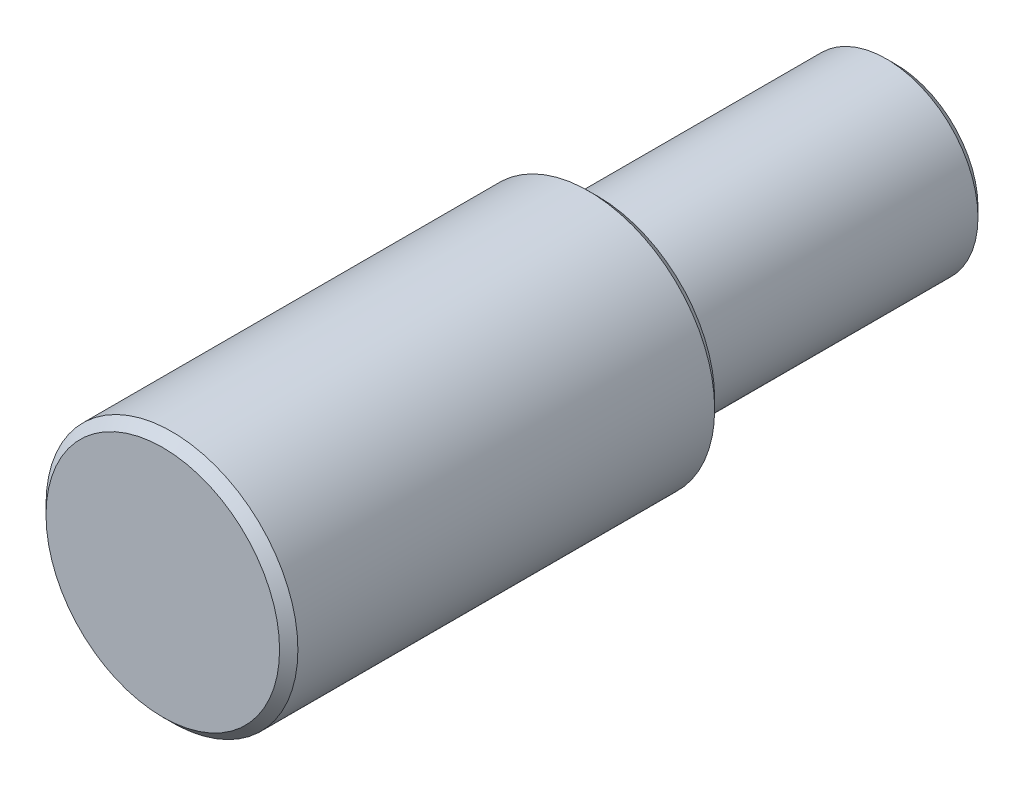
ISO-10303-21;
HEADER;
FILE_DESCRIPTION(('STEP AP214'),'2;1');
FILE_NAME('part.step','',(''),(''),'','','');
FILE_SCHEMA(('AUTOMOTIVE_DESIGN { 1 0 10303 214 1 1 1 1 }'));
ENDSEC;
DATA;
#1=APPLICATION_CONTEXT('core data for automotive mechanical design processes');
#2=APPLICATION_PROTOCOL_DEFINITION('international standard','automotive_design',2000,#1);
#3=PRODUCT_CONTEXT('',#1,'mechanical');
#4=PRODUCT('Part','Part','',(#3));
#5=PRODUCT_RELATED_PRODUCT_CATEGORY('part','',(#4));
#6=PRODUCT_DEFINITION_FORMATION('','',#4);
#7=PRODUCT_DEFINITION_CONTEXT('part definition',#1,'design');
#8=PRODUCT_DEFINITION('design','',#6,#7);
#9=PRODUCT_DEFINITION_SHAPE('','',#8);
#10=(LENGTH_UNIT() NAMED_UNIT(*) SI_UNIT(.MILLI.,.METRE.));
#11=(NAMED_UNIT(*) PLANE_ANGLE_UNIT() SI_UNIT($,.RADIAN.));
#12=(NAMED_UNIT(*) SI_UNIT($,.STERADIAN.) SOLID_ANGLE_UNIT());
#13=UNCERTAINTY_MEASURE_WITH_UNIT(LENGTH_MEASURE(1.E-05),#10,'distance_accuracy_value','');
#14=(GEOMETRIC_REPRESENTATION_CONTEXT(3) GLOBAL_UNCERTAINTY_ASSIGNED_CONTEXT((#13)) GLOBAL_UNIT_ASSIGNED_CONTEXT((#10,
#11,#12)) REPRESENTATION_CONTEXT('',''));
#15=CARTESIAN_POINT('',(0.,0.,0.));
#16=DIRECTION('',(0.,0.,1.));
#17=DIRECTION('',(1.,0.,0.));
#18=AXIS2_PLACEMENT_3D('',#15,#16,#17);
#19=CARTESIAN_POINT('',(0.,0.,65.));
#20=DIRECTION('',(0.,0.,-1.));
#21=DIRECTION('',(-1.,0.,0.));
#22=AXIS2_PLACEMENT_3D('',#19,#20,#21);
#23=CYLINDRICAL_SURFACE('',#22,20.);
#24=CARTESIAN_POINT('',(0.,0.,1.99999999999999));
#25=DIRECTION('',(0.,0.,1.));
#26=DIRECTION('',(1.,0.,0.));
#27=AXIS2_PLACEMENT_3D('',#24,#25,#26);
#28=CIRCLE('',#27,20.);
#29=CARTESIAN_POINT('',(20.,0.,1.99999999999999));
#30=VERTEX_POINT('',#29);
#31=EDGE_CURVE('E41',#30,#30,#28,.T.);
#32=ORIENTED_EDGE('',*,*,#31,.T.);
#33=EDGE_LOOP('',(#32));
#34=FACE_BOUND('',#33,.T.);
#35=CARTESIAN_POINT('',(0.,0.,65.));
#36=DIRECTION('',(0.,0.,1.));
#37=DIRECTION('',(1.,0.,0.));
#38=AXIS2_PLACEMENT_3D('',#35,#36,#37);
#39=CIRCLE('',#38,20.);
#40=CARTESIAN_POINT('',(20.,0.,65.));
#41=VERTEX_POINT('',#40);
#42=EDGE_CURVE('E60',#41,#41,#39,.T.);
#43=ORIENTED_EDGE('',*,*,#42,.F.);
#44=EDGE_LOOP('',(#43));
#45=FACE_BOUND('',#44,.T.);
#46=ADVANCED_FACE('F34',(#34,#45),#23,.T.);
#47=CARTESIAN_POINT('',(0.,0.,0.));
#48=DIRECTION('',(0.,0.,1.));
#49=DIRECTION('',(1.,0.,0.));
#50=AXIS2_PLACEMENT_3D('',#47,#48,#49);
#51=PLANE('',#50);
#52=CARTESIAN_POINT('',(0.,0.,0.));
#53=DIRECTION('',(0.,0.,1.));
#54=DIRECTION('',(1.,0.,0.));
#55=AXIS2_PLACEMENT_3D('',#52,#53,#54);
#56=CIRCLE('',#55,18.);
#57=CARTESIAN_POINT('',(18.,0.,0.));
#58=VERTEX_POINT('',#57);
#59=EDGE_CURVE('E10',#58,#58,#56,.F.);
#60=ORIENTED_EDGE('',*,*,#59,.T.);
#61=EDGE_LOOP('',(#60));
#62=FACE_BOUND('',#61,.T.);
#63=ADVANCED_FACE('F67',(#62),#51,.F.);
#64=CARTESIAN_POINT('',(0.,0.,65.));
#65=DIRECTION('',(0.,0.,1.));
#66=DIRECTION('',(1.,0.,0.));
#67=AXIS2_PLACEMENT_3D('',#64,#65,#66);
#68=PLANE('',#67);
#69=CARTESIAN_POINT('',(0.,0.,65.));
#70=DIRECTION('',(0.,0.,1.));
#71=DIRECTION('',(1.,0.,0.));
#72=AXIS2_PLACEMENT_3D('',#69,#70,#71);
#73=CIRCLE('',#72,25.4999999999999);
#74=CARTESIAN_POINT('',(25.4999999999999,0.,65.));
#75=VERTEX_POINT('',#74);
#76=EDGE_CURVE('E45',#75,#75,#73,.F.);
#77=ORIENTED_EDGE('',*,*,#76,.T.);
#78=EDGE_LOOP('',(#77));
#79=FACE_BOUND('',#78,.T.);
#80=ORIENTED_EDGE('',*,*,#42,.T.);
#81=EDGE_LOOP('',(#80));
#82=FACE_BOUND('',#81,.T.);
#83=ADVANCED_FACE('F64',(#79,#82),#68,.F.);
#84=CARTESIAN_POINT('',(0.,0.,160.));
#85=DIRECTION('',(0.,0.,-1.));
#86=DIRECTION('',(-1.,0.,0.));
#87=AXIS2_PLACEMENT_3D('',#84,#85,#86);
#88=CYLINDRICAL_SURFACE('',#87,27.5);
#89=CARTESIAN_POINT('',(0.,0.,158.));
#90=DIRECTION('',(0.,0.,1.));
#91=DIRECTION('',(1.,0.,0.));
#92=AXIS2_PLACEMENT_3D('',#89,#90,#91);
#93=CIRCLE('',#92,27.5);
#94=CARTESIAN_POINT('',(27.5,0.,158.));
#95=VERTEX_POINT('',#94);
#96=EDGE_CURVE('E49',#95,#95,#93,.F.);
#97=ORIENTED_EDGE('',*,*,#96,.T.);
#98=EDGE_LOOP('',(#97));
#99=FACE_BOUND('',#98,.T.);
#100=CARTESIAN_POINT('',(0.,0.,67.));
#101=DIRECTION('',(0.,0.,1.));
#102=DIRECTION('',(1.,0.,0.));
#103=AXIS2_PLACEMENT_3D('',#100,#101,#102);
#104=CIRCLE('',#103,27.5);
#105=CARTESIAN_POINT('',(27.5,0.,67.));
#106=VERTEX_POINT('',#105);
#107=EDGE_CURVE('E54',#106,#106,#104,.T.);
#108=ORIENTED_EDGE('',*,*,#107,.T.);
#109=EDGE_LOOP('',(#108));
#110=FACE_BOUND('',#109,.T.);
#111=ADVANCED_FACE('F90',(#99,#110),#88,.T.);
#112=CARTESIAN_POINT('',(0.,0.,160.));
#113=DIRECTION('',(0.,0.,1.));
#114=DIRECTION('',(1.,0.,0.));
#115=AXIS2_PLACEMENT_3D('',#112,#113,#114);
#116=PLANE('',#115);
#117=CARTESIAN_POINT('',(0.,0.,160.));
#118=DIRECTION('',(0.,0.,1.));
#119=DIRECTION('',(1.,0.,0.));
#120=AXIS2_PLACEMENT_3D('',#117,#118,#119);
#121=CIRCLE('',#120,25.5);
#122=CARTESIAN_POINT('',(25.5,0.,160.));
#123=VERTEX_POINT('',#122);
#124=EDGE_CURVE('E57',#123,#123,#121,.T.);
#125=ORIENTED_EDGE('',*,*,#124,.T.);
#126=EDGE_LOOP('',(#125));
#127=FACE_BOUND('',#126,.T.);
#128=ADVANCED_FACE('F78',(#127),#116,.T.);
#129=CARTESIAN_POINT('',(0.,0.,160.));
#130=DIRECTION('',(0.,0.,-1.));
#131=DIRECTION('',(-1.,0.,0.));
#132=AXIS2_PLACEMENT_3D('',#129,#130,#131);
#133=CONICAL_SURFACE('',#132,25.5,0.785398163397449);
#134=ORIENTED_EDGE('',*,*,#96,.F.);
#135=EDGE_LOOP('',(#134));
#136=FACE_BOUND('',#135,.T.);
#137=ORIENTED_EDGE('',*,*,#124,.F.);
#138=EDGE_LOOP('',(#137));
#139=FACE_BOUND('',#138,.T.);
#140=ADVANCED_FACE('F75',(#136,#139),#133,.T.);
#141=CARTESIAN_POINT('',(0.,0.,67.));
#142=DIRECTION('',(0.,0.,1.));
#143=DIRECTION('',(1.,0.,0.));
#144=AXIS2_PLACEMENT_3D('',#141,#142,#143);
#145=CONICAL_SURFACE('',#144,27.5,0.785398163397456);
#146=ORIENTED_EDGE('',*,*,#76,.F.);
#147=EDGE_LOOP('',(#146));
#148=FACE_BOUND('',#147,.T.);
#149=ORIENTED_EDGE('',*,*,#107,.F.);
#150=EDGE_LOOP('',(#149));
#151=FACE_BOUND('',#150,.T.);
#152=ADVANCED_FACE('F77',(#148,#151),#145,.T.);
#153=CARTESIAN_POINT('',(0.,0.,1.99999999999999));
#154=DIRECTION('',(0.,0.,1.));
#155=DIRECTION('',(1.,0.,0.));
#156=AXIS2_PLACEMENT_3D('',#153,#154,#155);
#157=CONICAL_SURFACE('',#156,20.,0.785398163397451);
#158=ORIENTED_EDGE('',*,*,#59,.F.);
#159=EDGE_LOOP('',(#158));
#160=FACE_BOUND('',#159,.T.);
#161=ORIENTED_EDGE('',*,*,#31,.F.);
#162=EDGE_LOOP('',(#161));
#163=FACE_BOUND('',#162,.T.);
#164=ADVANCED_FACE('F36',(#160,#163),#157,.T.);
#165=CLOSED_SHELL('',(#46,#63,#83,#111,#128,#140,#152,#164));
#166=MANIFOLD_SOLID_BREP('B2',#165);
#167=ADVANCED_BREP_SHAPE_REPRESENTATION('',(#18,#166),#14);
#168=SHAPE_DEFINITION_REPRESENTATION(#9,#167);
ENDSEC;
END-ISO-10303-21;
